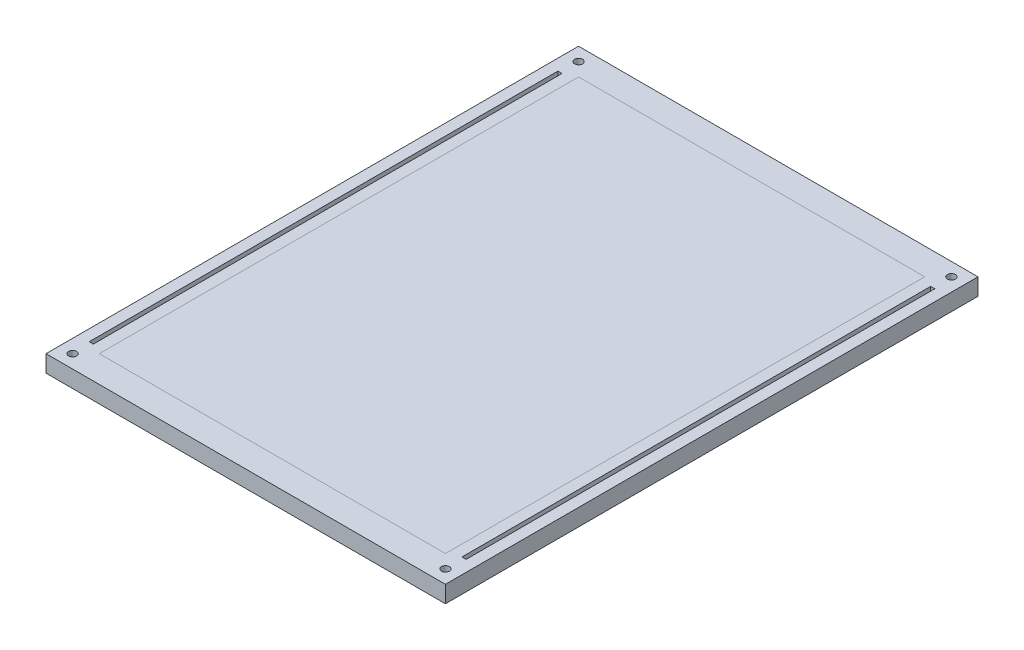
ISO-10303-21;
HEADER;
FILE_DESCRIPTION(('STEP AP214'),'2;1');
FILE_NAME('part.step','',(''),(''),'','','');
FILE_SCHEMA(('AUTOMOTIVE_DESIGN { 1 0 10303 214 1 1 1 1 }'));
ENDSEC;
DATA;
#1=APPLICATION_CONTEXT('core data for automotive mechanical design processes');
#2=APPLICATION_PROTOCOL_DEFINITION('international standard','automotive_design',2000,#1);
#3=PRODUCT_CONTEXT('',#1,'mechanical');
#4=PRODUCT('Part','Part','',(#3));
#5=PRODUCT_RELATED_PRODUCT_CATEGORY('part','',(#4));
#6=PRODUCT_DEFINITION_FORMATION('','',#4);
#7=PRODUCT_DEFINITION_CONTEXT('part definition',#1,'design');
#8=PRODUCT_DEFINITION('design','',#6,#7);
#9=PRODUCT_DEFINITION_SHAPE('','',#8);
#10=(LENGTH_UNIT() NAMED_UNIT(*) SI_UNIT(.MILLI.,.METRE.));
#11=(NAMED_UNIT(*) PLANE_ANGLE_UNIT() SI_UNIT($,.RADIAN.));
#12=(NAMED_UNIT(*) SI_UNIT($,.STERADIAN.) SOLID_ANGLE_UNIT());
#13=UNCERTAINTY_MEASURE_WITH_UNIT(LENGTH_MEASURE(1.E-05),#10,'distance_accuracy_value','');
#14=(GEOMETRIC_REPRESENTATION_CONTEXT(3) GLOBAL_UNCERTAINTY_ASSIGNED_CONTEXT((#13)) GLOBAL_UNIT_ASSIGNED_CONTEXT((#10,
#11,#12)) REPRESENTATION_CONTEXT('',''));
#15=CARTESIAN_POINT('',(0.,0.,0.));
#16=DIRECTION('',(0.,0.,1.));
#17=DIRECTION('',(1.,0.,0.));
#18=AXIS2_PLACEMENT_3D('',#15,#16,#17);
#19=CARTESIAN_POINT('',(65.0000000000001,0.,0.));
#20=DIRECTION('',(-1.,0.,0.));
#21=DIRECTION('',(0.,0.,1.));
#22=AXIS2_PLACEMENT_3D('',#19,#20,#21);
#23=PLANE('',#22);
#24=DIRECTION('',(0.,-1.,0.));
#25=VECTOR('',#24,1.);
#26=CARTESIAN_POINT('',(65.0000000000001,3.175,-90.));
#27=LINE('',#26,#25);
#28=CARTESIAN_POINT('',(65.0000000000001,3.175,-90.));
#29=VERTEX_POINT('',#28);
#30=CARTESIAN_POINT('',(65.0000000000001,-3.175,-90.));
#31=VERTEX_POINT('',#30);
#32=EDGE_CURVE('E108',#29,#31,#27,.T.);
#33=ORIENTED_EDGE('',*,*,#32,.F.);
#34=DIRECTION('',(0.,0.,-1.));
#35=VECTOR('',#34,1.);
#36=CARTESIAN_POINT('',(65.0000000000001,3.175,90.));
#37=LINE('',#36,#35);
#38=CARTESIAN_POINT('',(65.0000000000001,3.175,90.));
#39=VERTEX_POINT('',#38);
#40=EDGE_CURVE('E119',#39,#29,#37,.T.);
#41=ORIENTED_EDGE('',*,*,#40,.F.);
#42=DIRECTION('',(0.,1.,0.));
#43=VECTOR('',#42,1.);
#44=CARTESIAN_POINT('',(65.0000000000001,-3.175,90.));
#45=LINE('',#44,#43);
#46=CARTESIAN_POINT('',(65.0000000000001,-3.175,90.));
#47=VERTEX_POINT('',#46);
#48=EDGE_CURVE('E110',#47,#39,#45,.T.);
#49=ORIENTED_EDGE('',*,*,#48,.F.);
#50=DIRECTION('',(0.,0.,1.));
#51=VECTOR('',#50,1.);
#52=CARTESIAN_POINT('',(65.0000000000001,-3.175,-90.));
#53=LINE('',#52,#51);
#54=EDGE_CURVE('E99',#31,#47,#53,.T.);
#55=ORIENTED_EDGE('',*,*,#54,.F.);
#56=EDGE_LOOP('',(#33,#41,#49,#55));
#57=FACE_BOUND('',#56,.T.);
#58=ADVANCED_FACE('F57',(#57),#23,.F.);
#59=CARTESIAN_POINT('',(-245.111972117347,3.175,90.));
#60=DIRECTION('',(0.,-1.,0.));
#61=DIRECTION('',(0.,0.,-1.));
#62=AXIS2_PLACEMENT_3D('',#59,#60,#61);
#63=PLANE('',#62);
#64=DIRECTION('',(1.,0.,0.));
#65=VECTOR('',#64,1.);
#66=CARTESIAN_POINT('',(-245.111972117347,3.175,-90.));
#67=LINE('',#66,#65);
#68=CARTESIAN_POINT('',(-65.,3.175,-90.));
#69=VERTEX_POINT('',#68);
#70=EDGE_CURVE('E113',#69,#29,#67,.T.);
#71=ORIENTED_EDGE('',*,*,#70,.F.);
#72=DIRECTION('',(0.,0.,1.));
#73=VECTOR('',#72,1.);
#74=CARTESIAN_POINT('',(-65.,3.175,90.));
#75=LINE('',#74,#73);
#76=CARTESIAN_POINT('',(-65.,3.175,90.));
#77=VERTEX_POINT('',#76);
#78=EDGE_CURVE('E61',#69,#77,#75,.T.);
#79=ORIENTED_EDGE('',*,*,#78,.T.);
#80=DIRECTION('',(1.,0.,0.));
#81=VECTOR('',#80,1.);
#82=CARTESIAN_POINT('',(-245.111972117347,3.175,90.));
#83=LINE('',#82,#81);
#84=EDGE_CURVE('E123',#77,#39,#83,.T.);
#85=ORIENTED_EDGE('',*,*,#84,.T.);
#86=ORIENTED_EDGE('',*,*,#40,.T.);
#87=EDGE_LOOP('',(#71,#79,#85,#86));
#88=FACE_BOUND('',#87,.T.);
#89=ADVANCED_FACE('F132',(#88),#63,.F.);
#90=CARTESIAN_POINT('',(-245.111972117347,-3.175,90.));
#91=DIRECTION('',(0.,0.,-1.));
#92=DIRECTION('',(-1.,0.,0.));
#93=AXIS2_PLACEMENT_3D('',#90,#91,#92);
#94=PLANE('',#93);
#95=ORIENTED_EDGE('',*,*,#84,.F.);
#96=DIRECTION('',(0.,-1.,0.));
#97=VECTOR('',#96,1.);
#98=CARTESIAN_POINT('',(-65.,-3.175,90.));
#99=LINE('',#98,#97);
#100=CARTESIAN_POINT('',(-65.,-3.175,90.));
#101=VERTEX_POINT('',#100);
#102=EDGE_CURVE('E129',#77,#101,#99,.T.);
#103=ORIENTED_EDGE('',*,*,#102,.T.);
#104=DIRECTION('',(1.,0.,0.));
#105=VECTOR('',#104,1.);
#106=CARTESIAN_POINT('',(-245.111972117347,-3.175,90.));
#107=LINE('',#106,#105);
#108=EDGE_CURVE('E104',#101,#47,#107,.T.);
#109=ORIENTED_EDGE('',*,*,#108,.T.);
#110=ORIENTED_EDGE('',*,*,#48,.T.);
#111=EDGE_LOOP('',(#95,#103,#109,#110));
#112=FACE_BOUND('',#111,.T.);
#113=ADVANCED_FACE('F128',(#112),#94,.F.);
#114=CARTESIAN_POINT('',(-245.111972117347,-3.175,-90.));
#115=DIRECTION('',(0.,1.,0.));
#116=DIRECTION('',(0.,0.,1.));
#117=AXIS2_PLACEMENT_3D('',#114,#115,#116);
#118=PLANE('',#117);
#119=ORIENTED_EDGE('',*,*,#108,.F.);
#120=DIRECTION('',(0.,0.,-1.));
#121=VECTOR('',#120,1.);
#122=CARTESIAN_POINT('',(-65.0000000000001,-3.175,-90.));
#123=LINE('',#122,#121);
#124=CARTESIAN_POINT('',(-65.0000000000001,-3.175,-90.));
#125=VERTEX_POINT('',#124);
#126=EDGE_CURVE('E66',#101,#125,#123,.T.);
#127=ORIENTED_EDGE('',*,*,#126,.T.);
#128=DIRECTION('',(1.,0.,0.));
#129=VECTOR('',#128,1.);
#130=CARTESIAN_POINT('',(-245.111972117347,-3.175,-90.));
#131=LINE('',#130,#129);
#132=EDGE_CURVE('E96',#125,#31,#131,.T.);
#133=ORIENTED_EDGE('',*,*,#132,.T.);
#134=ORIENTED_EDGE('',*,*,#54,.T.);
#135=EDGE_LOOP('',(#119,#127,#133,#134));
#136=FACE_BOUND('',#135,.T.);
#137=ADVANCED_FACE('F98',(#136),#118,.F.);
#138=CARTESIAN_POINT('',(-245.111972117347,3.175,-90.));
#139=DIRECTION('',(0.,0.,1.));
#140=DIRECTION('',(1.,0.,0.));
#141=AXIS2_PLACEMENT_3D('',#138,#139,#140);
#142=PLANE('',#141);
#143=ORIENTED_EDGE('',*,*,#132,.F.);
#144=DIRECTION('',(0.,1.,0.));
#145=VECTOR('',#144,1.);
#146=CARTESIAN_POINT('',(-65.0000000000001,3.175,-90.));
#147=LINE('',#146,#145);
#148=EDGE_CURVE('E12',#125,#69,#147,.T.);
#149=ORIENTED_EDGE('',*,*,#148,.T.);
#150=ORIENTED_EDGE('',*,*,#70,.T.);
#151=ORIENTED_EDGE('',*,*,#32,.T.);
#152=EDGE_LOOP('',(#143,#149,#150,#151));
#153=FACE_BOUND('',#152,.T.);
#154=ADVANCED_FACE('F59',(#153),#142,.F.);
#155=CARTESIAN_POINT('',(-65.,3.175,90.));
#156=DIRECTION('',(1.,0.,0.));
#157=DIRECTION('',(0.,0.,-1.));
#158=AXIS2_PLACEMENT_3D('',#155,#156,#157);
#159=PLANE('',#158);
#160=ORIENTED_EDGE('',*,*,#126,.F.);
#161=ORIENTED_EDGE('',*,*,#102,.F.);
#162=ORIENTED_EDGE('',*,*,#78,.F.);
#163=ORIENTED_EDGE('',*,*,#148,.F.);
#164=EDGE_LOOP('',(#160,#161,#162,#163));
#165=FACE_BOUND('',#164,.T.);
#166=ADVANCED_FACE('F146',(#165),#159,.F.);
#167=CLOSED_SHELL('',(#58,#89,#113,#137,#154,#166));
#168=MANIFOLD_SOLID_BREP('B2',#167);
#169=CARTESIAN_POINT('',(0.,3.175,0.));
#170=DIRECTION('',(0.,-1.,0.));
#171=DIRECTION('',(0.,0.,-1.));
#172=AXIS2_PLACEMENT_3D('',#169,#170,#171);
#173=PLANE('',#172);
#174=CARTESIAN_POINT('',(-70.0000000000001,3.175,95.));
#175=DIRECTION('',(0.,1.,0.));
#176=DIRECTION('',(0.,0.,-1.));
#177=AXIS2_PLACEMENT_3D('',#174,#175,#176);
#178=CIRCLE('',#177,1.5);
#179=CARTESIAN_POINT('',(-70.0000000000001,3.175,93.5));
#180=VERTEX_POINT('',#179);
#181=EDGE_CURVE('E564',#180,#180,#178,.T.);
#182=ORIENTED_EDGE('',*,*,#181,.F.);
#183=EDGE_LOOP('',(#182));
#184=FACE_BOUND('',#183,.T.);
#185=CARTESIAN_POINT('',(70.0000000000001,3.175,95.));
#186=DIRECTION('',(0.,1.,0.));
#187=DIRECTION('',(0.,0.,1.));
#188=AXIS2_PLACEMENT_3D('',#185,#186,#187);
#189=CIRCLE('',#188,1.5);
#190=CARTESIAN_POINT('',(70.0000000000001,3.175,96.5));
#191=VERTEX_POINT('',#190);
#192=EDGE_CURVE('E556',#191,#191,#189,.T.);
#193=ORIENTED_EDGE('',*,*,#192,.F.);
#194=EDGE_LOOP('',(#193));
#195=FACE_BOUND('',#194,.T.);
#196=CARTESIAN_POINT('',(70.0000000000001,3.175,-95.));
#197=DIRECTION('',(0.,1.,0.));
#198=DIRECTION('',(0.,0.,-1.));
#199=AXIS2_PLACEMENT_3D('',#196,#197,#198);
#200=CIRCLE('',#199,1.5);
#201=CARTESIAN_POINT('',(70.0000000000001,3.175,-96.5));
#202=VERTEX_POINT('',#201);
#203=EDGE_CURVE('E549',#202,#202,#200,.T.);
#204=ORIENTED_EDGE('',*,*,#203,.F.);
#205=EDGE_LOOP('',(#204));
#206=FACE_BOUND('',#205,.T.);
#207=CARTESIAN_POINT('',(-70.0000000000001,3.175,-95.));
#208=DIRECTION('',(0.,1.,0.));
#209=DIRECTION('',(0.,0.,1.));
#210=AXIS2_PLACEMENT_3D('',#207,#208,#209);
#211=CIRCLE('',#210,1.5);
#212=CARTESIAN_POINT('',(-70.0000000000001,3.175,-93.5));
#213=VERTEX_POINT('',#212);
#214=EDGE_CURVE('E554',#213,#213,#211,.T.);
#215=ORIENTED_EDGE('',*,*,#214,.F.);
#216=EDGE_LOOP('',(#215));
#217=FACE_BOUND('',#216,.T.);
#218=DIRECTION('',(0.,0.,1.));
#219=VECTOR('',#218,1.);
#220=CARTESIAN_POINT('',(-65.,3.175,90.));
#221=LINE('',#220,#219);
#222=CARTESIAN_POINT('',(-65.,3.175,-90.));
#223=VERTEX_POINT('',#222);
#224=CARTESIAN_POINT('',(-65.,3.175,90.));
#225=VERTEX_POINT('',#224);
#226=EDGE_CURVE('E369',#223,#225,#221,.T.);
#227=ORIENTED_EDGE('',*,*,#226,.F.);
#228=DIRECTION('',(-1.,0.,0.));
#229=VECTOR('',#228,1.);
#230=CARTESIAN_POINT('',(-65.,3.175,-90.));
#231=LINE('',#230,#229);
#232=CARTESIAN_POINT('',(65.0000000000001,3.175,-90.));
#233=VERTEX_POINT('',#232);
#234=EDGE_CURVE('E377',#233,#223,#231,.T.);
#235=ORIENTED_EDGE('',*,*,#234,.F.);
#236=DIRECTION('',(0.,0.,-1.));
#237=VECTOR('',#236,1.);
#238=CARTESIAN_POINT('',(65.0000000000001,3.175,90.));
#239=LINE('',#238,#237);
#240=CARTESIAN_POINT('',(65.0000000000001,3.175,90.));
#241=VERTEX_POINT('',#240);
#242=EDGE_CURVE('E374',#241,#233,#239,.T.);
#243=ORIENTED_EDGE('',*,*,#242,.F.);
#244=DIRECTION('',(1.,0.,0.));
#245=VECTOR('',#244,1.);
#246=CARTESIAN_POINT('',(-65.,3.175,90.));
#247=LINE('',#246,#245);
#248=EDGE_CURVE('E371',#225,#241,#247,.T.);
#249=ORIENTED_EDGE('',*,*,#248,.F.);
#250=EDGE_LOOP('',(#227,#235,#243,#249));
#251=FACE_BOUND('',#250,.T.);
#252=DIRECTION('',(0.,0.,-1.));
#253=VECTOR('',#252,1.);
#254=CARTESIAN_POINT('',(75.0000000000001,3.175,100.));
#255=LINE('',#254,#253);
#256=CARTESIAN_POINT('',(75.0000000000001,3.175,100.));
#257=VERTEX_POINT('',#256);
#258=CARTESIAN_POINT('',(75.,3.175,-100.));
#259=VERTEX_POINT('',#258);
#260=EDGE_CURVE('E402',#257,#259,#255,.T.);
#261=ORIENTED_EDGE('',*,*,#260,.T.);
#262=DIRECTION('',(-1.,0.,0.));
#263=VECTOR('',#262,1.);
#264=CARTESIAN_POINT('',(-75.,3.175,-100.));
#265=LINE('',#264,#263);
#266=CARTESIAN_POINT('',(-75.,3.175,-100.));
#267=VERTEX_POINT('',#266);
#268=EDGE_CURVE('E405',#259,#267,#265,.T.);
#269=ORIENTED_EDGE('',*,*,#268,.T.);
#270=DIRECTION('',(0.,0.,1.));
#271=VECTOR('',#270,1.);
#272=CARTESIAN_POINT('',(-75.,3.175,100.));
#273=LINE('',#272,#271);
#274=CARTESIAN_POINT('',(-75.,3.175,100.));
#275=VERTEX_POINT('',#274);
#276=EDGE_CURVE('E409',#267,#275,#273,.T.);
#277=ORIENTED_EDGE('',*,*,#276,.T.);
#278=DIRECTION('',(1.,0.,0.));
#279=VECTOR('',#278,1.);
#280=CARTESIAN_POINT('',(-75.,3.175,100.));
#281=LINE('',#280,#279);
#282=EDGE_CURVE('E411',#275,#257,#281,.T.);
#283=ORIENTED_EDGE('',*,*,#282,.T.);
#284=EDGE_LOOP('',(#261,#269,#277,#283));
#285=FACE_BOUND('',#284,.T.);
#286=DIRECTION('',(-1.,0.,0.));
#287=VECTOR('',#286,1.);
#288=CARTESIAN_POINT('',(-70.777875,3.175,-88.));
#289=LINE('',#288,#287);
#290=CARTESIAN_POINT('',(-69.222125,3.175,-88.));
#291=VERTEX_POINT('',#290);
#292=CARTESIAN_POINT('',(-70.777875,3.175,-88.));
#293=VERTEX_POINT('',#292);
#294=EDGE_CURVE('E347',#291,#293,#289,.T.);
#295=ORIENTED_EDGE('',*,*,#294,.F.);
#296=DIRECTION('',(0.,0.,-1.));
#297=VECTOR('',#296,1.);
#298=CARTESIAN_POINT('',(-69.222125,3.175,88.));
#299=LINE('',#298,#297);
#300=CARTESIAN_POINT('',(-69.222125,3.175,88.));
#301=VERTEX_POINT('',#300);
#302=EDGE_CURVE('E345',#301,#291,#299,.T.);
#303=ORIENTED_EDGE('',*,*,#302,.F.);
#304=DIRECTION('',(1.,0.,0.));
#305=VECTOR('',#304,1.);
#306=CARTESIAN_POINT('',(-70.777875,3.175,88.));
#307=LINE('',#306,#305);
#308=CARTESIAN_POINT('',(-70.777875,3.175,88.));
#309=VERTEX_POINT('',#308);
#310=EDGE_CURVE('E353',#309,#301,#307,.T.);
#311=ORIENTED_EDGE('',*,*,#310,.F.);
#312=DIRECTION('',(0.,0.,1.));
#313=VECTOR('',#312,1.);
#314=CARTESIAN_POINT('',(-70.777875,3.175,88.));
#315=LINE('',#314,#313);
#316=EDGE_CURVE('E350',#293,#309,#315,.T.);
#317=ORIENTED_EDGE('',*,*,#316,.F.);
#318=EDGE_LOOP('',(#295,#303,#311,#317));
#319=FACE_BOUND('',#318,.T.);
#320=DIRECTION('',(0.,0.,-1.));
#321=VECTOR('',#320,1.);
#322=CARTESIAN_POINT('',(69.222125,3.175,88.));
#323=LINE('',#322,#321);
#324=CARTESIAN_POINT('',(69.222125,3.175,88.));
#325=VERTEX_POINT('',#324);
#326=CARTESIAN_POINT('',(69.222125,3.175,-88.));
#327=VERTEX_POINT('',#326);
#328=EDGE_CURVE('E203',#325,#327,#323,.T.);
#329=ORIENTED_EDGE('',*,*,#328,.T.);
#330=DIRECTION('',(1.,0.,0.));
#331=VECTOR('',#330,1.);
#332=CARTESIAN_POINT('',(70.777875,3.175,-88.));
#333=LINE('',#332,#331);
#334=CARTESIAN_POINT('',(70.777875,3.175,-88.));
#335=VERTEX_POINT('',#334);
#336=EDGE_CURVE('E309',#327,#335,#333,.T.);
#337=ORIENTED_EDGE('',*,*,#336,.T.);
#338=DIRECTION('',(0.,0.,1.));
#339=VECTOR('',#338,1.);
#340=CARTESIAN_POINT('',(70.777875,3.175,88.));
#341=LINE('',#340,#339);
#342=CARTESIAN_POINT('',(70.777875,3.175,88.));
#343=VERTEX_POINT('',#342);
#344=EDGE_CURVE('E328',#335,#343,#341,.T.);
#345=ORIENTED_EDGE('',*,*,#344,.T.);
#346=DIRECTION('',(-1.,0.,0.));
#347=VECTOR('',#346,1.);
#348=CARTESIAN_POINT('',(70.777875,3.175,88.));
#349=LINE('',#348,#347);
#350=EDGE_CURVE('E322',#343,#325,#349,.T.);
#351=ORIENTED_EDGE('',*,*,#350,.T.);
#352=EDGE_LOOP('',(#329,#337,#345,#351));
#353=FACE_BOUND('',#352,.T.);
#354=ADVANCED_FACE('F188',(#184,#195,#206,#217,#251,#285,#319,#353),#173,.F.);
#355=CARTESIAN_POINT('',(0.,-3.175,0.));
#356=DIRECTION('',(0.,-1.,0.));
#357=DIRECTION('',(0.,0.,-1.));
#358=AXIS2_PLACEMENT_3D('',#355,#356,#357);
#359=PLANE('',#358);
#360=CARTESIAN_POINT('',(-70.0000000000001,-3.175,95.));
#361=DIRECTION('',(0.,-1.,0.));
#362=DIRECTION('',(0.,0.,-1.));
#363=AXIS2_PLACEMENT_3D('',#360,#361,#362);
#364=CIRCLE('',#363,1.5);
#365=CARTESIAN_POINT('',(-70.0000000000001,-3.175,93.5));
#366=VERTEX_POINT('',#365);
#367=EDGE_CURVE('E567',#366,#366,#364,.F.);
#368=ORIENTED_EDGE('',*,*,#367,.T.);
#369=EDGE_LOOP('',(#368));
#370=FACE_BOUND('',#369,.T.);
#371=CARTESIAN_POINT('',(70.0000000000001,-3.175,95.));
#372=DIRECTION('',(0.,-1.,0.));
#373=DIRECTION('',(0.,0.,-1.));
#374=AXIS2_PLACEMENT_3D('',#371,#372,#373);
#375=CIRCLE('',#374,1.5);
#376=CARTESIAN_POINT('',(70.0000000000001,-3.175,93.5));
#377=VERTEX_POINT('',#376);
#378=EDGE_CURVE('E561',#377,#377,#375,.F.);
#379=ORIENTED_EDGE('',*,*,#378,.T.);
#380=EDGE_LOOP('',(#379));
#381=FACE_BOUND('',#380,.T.);
#382=CARTESIAN_POINT('',(70.0000000000001,-3.175,-95.));
#383=DIRECTION('',(0.,-1.,0.));
#384=DIRECTION('',(0.,0.,-1.));
#385=AXIS2_PLACEMENT_3D('',#382,#383,#384);
#386=CIRCLE('',#385,1.5);
#387=CARTESIAN_POINT('',(70.0000000000001,-3.175,-96.5));
#388=VERTEX_POINT('',#387);
#389=EDGE_CURVE('E546',#388,#388,#386,.F.);
#390=ORIENTED_EDGE('',*,*,#389,.T.);
#391=EDGE_LOOP('',(#390));
#392=FACE_BOUND('',#391,.T.);
#393=CARTESIAN_POINT('',(-70.0000000000001,-3.175,-95.));
#394=DIRECTION('',(0.,-1.,0.));
#395=DIRECTION('',(0.,0.,-1.));
#396=AXIS2_PLACEMENT_3D('',#393,#394,#395);
#397=CIRCLE('',#396,1.5);
#398=CARTESIAN_POINT('',(-70.0000000000001,-3.175,-96.5));
#399=VERTEX_POINT('',#398);
#400=EDGE_CURVE('E551',#399,#399,#397,.F.);
#401=ORIENTED_EDGE('',*,*,#400,.T.);
#402=EDGE_LOOP('',(#401));
#403=FACE_BOUND('',#402,.T.);
#404=DIRECTION('',(0.,0.,-1.));
#405=VECTOR('',#404,1.);
#406=CARTESIAN_POINT('',(-69.222125,-3.175,88.));
#407=LINE('',#406,#405);
#408=CARTESIAN_POINT('',(-69.222125,-3.175,88.));
#409=VERTEX_POINT('',#408);
#410=CARTESIAN_POINT('',(-69.222125,-3.175,-88.));
#411=VERTEX_POINT('',#410);
#412=EDGE_CURVE('E342',#409,#411,#407,.T.);
#413=ORIENTED_EDGE('',*,*,#412,.T.);
#414=DIRECTION('',(-1.,0.,0.));
#415=VECTOR('',#414,1.);
#416=CARTESIAN_POINT('',(-70.777875,-3.175,-88.));
#417=LINE('',#416,#415);
#418=CARTESIAN_POINT('',(-70.777875,-3.175,-88.));
#419=VERTEX_POINT('',#418);
#420=EDGE_CURVE('E359',#411,#419,#417,.T.);
#421=ORIENTED_EDGE('',*,*,#420,.T.);
#422=DIRECTION('',(0.,0.,1.));
#423=VECTOR('',#422,1.);
#424=CARTESIAN_POINT('',(-70.777875,-3.175,88.));
#425=LINE('',#424,#423);
#426=CARTESIAN_POINT('',(-70.777875,-3.175,88.));
#427=VERTEX_POINT('',#426);
#428=EDGE_CURVE('E315',#419,#427,#425,.T.);
#429=ORIENTED_EDGE('',*,*,#428,.T.);
#430=DIRECTION('',(1.,0.,0.));
#431=VECTOR('',#430,1.);
#432=CARTESIAN_POINT('',(-70.777875,-3.175,88.));
#433=LINE('',#432,#431);
#434=EDGE_CURVE('E339',#427,#409,#433,.T.);
#435=ORIENTED_EDGE('',*,*,#434,.T.);
#436=EDGE_LOOP('',(#413,#421,#429,#435));
#437=FACE_BOUND('',#436,.T.);
#438=DIRECTION('',(0.,0.,-1.));
#439=VECTOR('',#438,1.);
#440=CARTESIAN_POINT('',(75.0000000000001,-3.175,100.));
#441=LINE('',#440,#439);
#442=CARTESIAN_POINT('',(75.0000000000001,-3.175,100.));
#443=VERTEX_POINT('',#442);
#444=CARTESIAN_POINT('',(75.,-3.175,-100.));
#445=VERTEX_POINT('',#444);
#446=EDGE_CURVE('E401',#443,#445,#441,.T.);
#447=ORIENTED_EDGE('',*,*,#446,.F.);
#448=DIRECTION('',(1.,0.,0.));
#449=VECTOR('',#448,1.);
#450=CARTESIAN_POINT('',(-75.,-3.175,100.));
#451=LINE('',#450,#449);
#452=CARTESIAN_POINT('',(-75.,-3.175,100.));
#453=VERTEX_POINT('',#452);
#454=EDGE_CURVE('E406',#453,#443,#451,.T.);
#455=ORIENTED_EDGE('',*,*,#454,.F.);
#456=DIRECTION('',(0.,0.,1.));
#457=VECTOR('',#456,1.);
#458=CARTESIAN_POINT('',(-75.,-3.175,100.));
#459=LINE('',#458,#457);
#460=CARTESIAN_POINT('',(-75.,-3.175,-100.));
#461=VERTEX_POINT('',#460);
#462=EDGE_CURVE('E419',#461,#453,#459,.T.);
#463=ORIENTED_EDGE('',*,*,#462,.F.);
#464=DIRECTION('',(-1.,0.,0.));
#465=VECTOR('',#464,1.);
#466=CARTESIAN_POINT('',(-75.,-3.175,-100.));
#467=LINE('',#466,#465);
#468=EDGE_CURVE('E416',#445,#461,#467,.T.);
#469=ORIENTED_EDGE('',*,*,#468,.F.);
#470=EDGE_LOOP('',(#447,#455,#463,#469));
#471=FACE_BOUND('',#470,.T.);
#472=DIRECTION('',(-1.,0.,0.));
#473=VECTOR('',#472,1.);
#474=CARTESIAN_POINT('',(-65.,-3.175,-90.));
#475=LINE('',#474,#473);
#476=CARTESIAN_POINT('',(65.0000000000001,-3.175,-90.));
#477=VERTEX_POINT('',#476);
#478=CARTESIAN_POINT('',(-65.,-3.175,-90.));
#479=VERTEX_POINT('',#478);
#480=EDGE_CURVE('E372',#477,#479,#475,.T.);
#481=ORIENTED_EDGE('',*,*,#480,.T.);
#482=DIRECTION('',(0.,0.,1.));
#483=VECTOR('',#482,1.);
#484=CARTESIAN_POINT('',(-65.,-3.175,90.));
#485=LINE('',#484,#483);
#486=CARTESIAN_POINT('',(-65.,-3.175,90.));
#487=VERTEX_POINT('',#486);
#488=EDGE_CURVE('E368',#479,#487,#485,.T.);
#489=ORIENTED_EDGE('',*,*,#488,.T.);
#490=DIRECTION('',(1.,0.,0.));
#491=VECTOR('',#490,1.);
#492=CARTESIAN_POINT('',(-65.,-3.175,90.));
#493=LINE('',#492,#491);
#494=CARTESIAN_POINT('',(65.0000000000001,-3.175,90.));
#495=VERTEX_POINT('',#494);
#496=EDGE_CURVE('E383',#487,#495,#493,.T.);
#497=ORIENTED_EDGE('',*,*,#496,.T.);
#498=DIRECTION('',(0.,0.,-1.));
#499=VECTOR('',#498,1.);
#500=CARTESIAN_POINT('',(65.0000000000001,-3.175,90.));
#501=LINE('',#500,#499);
#502=EDGE_CURVE('E386',#495,#477,#501,.T.);
#503=ORIENTED_EDGE('',*,*,#502,.T.);
#504=EDGE_LOOP('',(#481,#489,#497,#503));
#505=FACE_BOUND('',#504,.T.);
#506=DIRECTION('',(1.,0.,0.));
#507=VECTOR('',#506,1.);
#508=CARTESIAN_POINT('',(70.777875,-3.175,-88.));
#509=LINE('',#508,#507);
#510=CARTESIAN_POINT('',(69.222125,-3.175,-88.));
#511=VERTEX_POINT('',#510);
#512=CARTESIAN_POINT('',(70.777875,-3.175,-88.));
#513=VERTEX_POINT('',#512);
#514=EDGE_CURVE('E320',#511,#513,#509,.T.);
#515=ORIENTED_EDGE('',*,*,#514,.F.);
#516=DIRECTION('',(0.,0.,-1.));
#517=VECTOR('',#516,1.);
#518=CARTESIAN_POINT('',(69.222125,-3.175,88.));
#519=LINE('',#518,#517);
#520=CARTESIAN_POINT('',(69.222125,-3.175,88.));
#521=VERTEX_POINT('',#520);
#522=EDGE_CURVE('E303',#521,#511,#519,.T.);
#523=ORIENTED_EDGE('',*,*,#522,.F.);
#524=DIRECTION('',(-1.,0.,0.));
#525=VECTOR('',#524,1.);
#526=CARTESIAN_POINT('',(70.777875,-3.175,88.));
#527=LINE('',#526,#525);
#528=CARTESIAN_POINT('',(70.777875,-3.175,88.));
#529=VERTEX_POINT('',#528);
#530=EDGE_CURVE('E312',#529,#521,#527,.T.);
#531=ORIENTED_EDGE('',*,*,#530,.F.);
#532=DIRECTION('',(0.,0.,1.));
#533=VECTOR('',#532,1.);
#534=CARTESIAN_POINT('',(70.777875,-3.175,88.));
#535=LINE('',#534,#533);
#536=EDGE_CURVE('E211',#513,#529,#535,.T.);
#537=ORIENTED_EDGE('',*,*,#536,.F.);
#538=EDGE_LOOP('',(#515,#523,#531,#537));
#539=FACE_BOUND('',#538,.T.);
#540=ADVANCED_FACE('F318',(#370,#381,#392,#403,#437,#471,#505,#539),#359,.T.);
#541=CARTESIAN_POINT('',(75.0000000000001,3.175,100.));
#542=DIRECTION('',(-1.,0.,0.));
#543=DIRECTION('',(0.,0.,1.));
#544=AXIS2_PLACEMENT_3D('',#541,#542,#543);
#545=PLANE('',#544);
#546=ORIENTED_EDGE('',*,*,#446,.T.);
#547=DIRECTION('',(0.,-1.,0.));
#548=VECTOR('',#547,1.);
#549=CARTESIAN_POINT('',(75.,3.175,-100.));
#550=LINE('',#549,#548);
#551=EDGE_CURVE('E55',#259,#445,#550,.T.);
#552=ORIENTED_EDGE('',*,*,#551,.F.);
#553=ORIENTED_EDGE('',*,*,#260,.F.);
#554=DIRECTION('',(0.,-1.,0.));
#555=VECTOR('',#554,1.);
#556=CARTESIAN_POINT('',(75.0000000000001,3.175,100.));
#557=LINE('',#556,#555);
#558=EDGE_CURVE('E413',#257,#443,#557,.T.);
#559=ORIENTED_EDGE('',*,*,#558,.T.);
#560=EDGE_LOOP('',(#546,#552,#553,#559));
#561=FACE_BOUND('',#560,.T.);
#562=ADVANCED_FACE('F190',(#561),#545,.F.);
#563=CARTESIAN_POINT('',(-75.,3.175,-100.));
#564=DIRECTION('',(0.,0.,1.));
#565=DIRECTION('',(1.,0.,0.));
#566=AXIS2_PLACEMENT_3D('',#563,#564,#565);
#567=PLANE('',#566);
#568=ORIENTED_EDGE('',*,*,#468,.T.);
#569=DIRECTION('',(0.,-1.,0.));
#570=VECTOR('',#569,1.);
#571=CARTESIAN_POINT('',(-75.,3.175,-100.));
#572=LINE('',#571,#570);
#573=EDGE_CURVE('E196',#267,#461,#572,.T.);
#574=ORIENTED_EDGE('',*,*,#573,.F.);
#575=ORIENTED_EDGE('',*,*,#268,.F.);
#576=ORIENTED_EDGE('',*,*,#551,.T.);
#577=EDGE_LOOP('',(#568,#574,#575,#576));
#578=FACE_BOUND('',#577,.T.);
#579=ADVANCED_FACE('F447',(#578),#567,.F.);
#580=CARTESIAN_POINT('',(-75.,3.175,100.));
#581=DIRECTION('',(1.,0.,0.));
#582=DIRECTION('',(0.,0.,-1.));
#583=AXIS2_PLACEMENT_3D('',#580,#581,#582);
#584=PLANE('',#583);
#585=ORIENTED_EDGE('',*,*,#462,.T.);
#586=DIRECTION('',(0.,-1.,0.));
#587=VECTOR('',#586,1.);
#588=CARTESIAN_POINT('',(-75.,3.175,100.));
#589=LINE('',#588,#587);
#590=EDGE_CURVE('E424',#275,#453,#589,.T.);
#591=ORIENTED_EDGE('',*,*,#590,.F.);
#592=ORIENTED_EDGE('',*,*,#276,.F.);
#593=ORIENTED_EDGE('',*,*,#573,.T.);
#594=EDGE_LOOP('',(#585,#591,#592,#593));
#595=FACE_BOUND('',#594,.T.);
#596=ADVANCED_FACE('F431',(#595),#584,.F.);
#597=CARTESIAN_POINT('',(-75.,3.175,100.));
#598=DIRECTION('',(0.,0.,-1.));
#599=DIRECTION('',(-1.,0.,0.));
#600=AXIS2_PLACEMENT_3D('',#597,#598,#599);
#601=PLANE('',#600);
#602=ORIENTED_EDGE('',*,*,#454,.T.);
#603=ORIENTED_EDGE('',*,*,#558,.F.);
#604=ORIENTED_EDGE('',*,*,#282,.F.);
#605=ORIENTED_EDGE('',*,*,#590,.T.);
#606=EDGE_LOOP('',(#602,#603,#604,#605));
#607=FACE_BOUND('',#606,.T.);
#608=ADVANCED_FACE('F440',(#607),#601,.F.);
#609=CARTESIAN_POINT('',(-65.,3.175,90.));
#610=DIRECTION('',(1.,0.,0.));
#611=DIRECTION('',(0.,0.,-1.));
#612=AXIS2_PLACEMENT_3D('',#609,#610,#611);
#613=PLANE('',#612);
#614=ORIENTED_EDGE('',*,*,#488,.F.);
#615=DIRECTION('',(0.,-1.,0.));
#616=VECTOR('',#615,1.);
#617=CARTESIAN_POINT('',(-65.,3.175,-90.));
#618=LINE('',#617,#616);
#619=EDGE_CURVE('E380',#223,#479,#618,.T.);
#620=ORIENTED_EDGE('',*,*,#619,.F.);
#621=ORIENTED_EDGE('',*,*,#226,.T.);
#622=DIRECTION('',(0.,-1.,0.));
#623=VECTOR('',#622,1.);
#624=CARTESIAN_POINT('',(-65.,3.175,90.));
#625=LINE('',#624,#623);
#626=EDGE_CURVE('E398',#225,#487,#625,.T.);
#627=ORIENTED_EDGE('',*,*,#626,.T.);
#628=EDGE_LOOP('',(#614,#620,#621,#627));
#629=FACE_BOUND('',#628,.T.);
#630=ADVANCED_FACE('F465',(#629),#613,.T.);
#631=CARTESIAN_POINT('',(-65.,3.175,90.));
#632=DIRECTION('',(0.,0.,-1.));
#633=DIRECTION('',(-1.,0.,0.));
#634=AXIS2_PLACEMENT_3D('',#631,#632,#633);
#635=PLANE('',#634);
#636=ORIENTED_EDGE('',*,*,#496,.F.);
#637=ORIENTED_EDGE('',*,*,#626,.F.);
#638=ORIENTED_EDGE('',*,*,#248,.T.);
#639=DIRECTION('',(0.,-1.,0.));
#640=VECTOR('',#639,1.);
#641=CARTESIAN_POINT('',(65.0000000000001,3.175,90.));
#642=LINE('',#641,#640);
#643=EDGE_CURVE('E396',#241,#495,#642,.T.);
#644=ORIENTED_EDGE('',*,*,#643,.T.);
#645=EDGE_LOOP('',(#636,#637,#638,#644));
#646=FACE_BOUND('',#645,.T.);
#647=ADVANCED_FACE('F472',(#646),#635,.T.);
#648=CARTESIAN_POINT('',(65.0000000000001,3.175,90.));
#649=DIRECTION('',(-1.,0.,0.));
#650=DIRECTION('',(0.,0.,1.));
#651=AXIS2_PLACEMENT_3D('',#648,#649,#650);
#652=PLANE('',#651);
#653=ORIENTED_EDGE('',*,*,#502,.F.);
#654=ORIENTED_EDGE('',*,*,#643,.F.);
#655=ORIENTED_EDGE('',*,*,#242,.T.);
#656=DIRECTION('',(0.,-1.,0.));
#657=VECTOR('',#656,1.);
#658=CARTESIAN_POINT('',(65.0000000000001,3.175,-90.));
#659=LINE('',#658,#657);
#660=EDGE_CURVE('E394',#233,#477,#659,.T.);
#661=ORIENTED_EDGE('',*,*,#660,.T.);
#662=EDGE_LOOP('',(#653,#654,#655,#661));
#663=FACE_BOUND('',#662,.T.);
#664=ADVANCED_FACE('F477',(#663),#652,.T.);
#665=CARTESIAN_POINT('',(-65.,3.175,-90.));
#666=DIRECTION('',(0.,0.,1.));
#667=DIRECTION('',(1.,0.,0.));
#668=AXIS2_PLACEMENT_3D('',#665,#666,#667);
#669=PLANE('',#668);
#670=ORIENTED_EDGE('',*,*,#480,.F.);
#671=ORIENTED_EDGE('',*,*,#660,.F.);
#672=ORIENTED_EDGE('',*,*,#234,.T.);
#673=ORIENTED_EDGE('',*,*,#619,.T.);
#674=EDGE_LOOP('',(#670,#671,#672,#673));
#675=FACE_BOUND('',#674,.T.);
#676=ADVANCED_FACE('F484',(#675),#669,.T.);
#677=CARTESIAN_POINT('',(-69.222125,-3.176,88.));
#678=DIRECTION('',(1.,0.,0.));
#679=DIRECTION('',(0.,0.,-1.));
#680=AXIS2_PLACEMENT_3D('',#677,#678,#679);
#681=PLANE('',#680);
#682=DIRECTION('',(0.,1.,0.));
#683=VECTOR('',#682,1.);
#684=CARTESIAN_POINT('',(-69.222125,-3.176,88.));
#685=LINE('',#684,#683);
#686=EDGE_CURVE('E357',#409,#301,#685,.T.);
#687=ORIENTED_EDGE('',*,*,#686,.T.);
#688=ORIENTED_EDGE('',*,*,#302,.T.);
#689=DIRECTION('',(0.,1.,0.));
#690=VECTOR('',#689,1.);
#691=CARTESIAN_POINT('',(-69.222125,-3.176,-88.));
#692=LINE('',#691,#690);
#693=EDGE_CURVE('E356',#411,#291,#692,.T.);
#694=ORIENTED_EDGE('',*,*,#693,.F.);
#695=ORIENTED_EDGE('',*,*,#412,.F.);
#696=EDGE_LOOP('',(#687,#688,#694,#695));
#697=FACE_BOUND('',#696,.T.);
#698=ADVANCED_FACE('F497',(#697),#681,.F.);
#699=CARTESIAN_POINT('',(-70.777875,-3.176,88.));
#700=DIRECTION('',(0.,0.,1.));
#701=DIRECTION('',(1.,0.,0.));
#702=AXIS2_PLACEMENT_3D('',#699,#700,#701);
#703=PLANE('',#702);
#704=DIRECTION('',(0.,1.,0.));
#705=VECTOR('',#704,1.);
#706=CARTESIAN_POINT('',(-70.777875,-3.176,88.));
#707=LINE('',#706,#705);
#708=EDGE_CURVE('E360',#427,#309,#707,.T.);
#709=ORIENTED_EDGE('',*,*,#708,.T.);
#710=ORIENTED_EDGE('',*,*,#310,.T.);
#711=ORIENTED_EDGE('',*,*,#686,.F.);
#712=ORIENTED_EDGE('',*,*,#434,.F.);
#713=EDGE_LOOP('',(#709,#710,#711,#712));
#714=FACE_BOUND('',#713,.T.);
#715=ADVANCED_FACE('F502',(#714),#703,.F.);
#716=CARTESIAN_POINT('',(-70.777875,-3.176,88.));
#717=DIRECTION('',(-1.,0.,0.));
#718=DIRECTION('',(0.,0.,1.));
#719=AXIS2_PLACEMENT_3D('',#716,#717,#718);
#720=PLANE('',#719);
#721=DIRECTION('',(0.,1.,0.));
#722=VECTOR('',#721,1.);
#723=CARTESIAN_POINT('',(-70.777875,-3.176,-88.));
#724=LINE('',#723,#722);
#725=EDGE_CURVE('E362',#419,#293,#724,.T.);
#726=ORIENTED_EDGE('',*,*,#725,.T.);
#727=ORIENTED_EDGE('',*,*,#316,.T.);
#728=ORIENTED_EDGE('',*,*,#708,.F.);
#729=ORIENTED_EDGE('',*,*,#428,.F.);
#730=EDGE_LOOP('',(#726,#727,#728,#729));
#731=FACE_BOUND('',#730,.T.);
#732=ADVANCED_FACE('F507',(#731),#720,.F.);
#733=CARTESIAN_POINT('',(-70.777875,-3.176,-88.));
#734=DIRECTION('',(0.,0.,-1.));
#735=DIRECTION('',(-1.,0.,0.));
#736=AXIS2_PLACEMENT_3D('',#733,#734,#735);
#737=PLANE('',#736);
#738=ORIENTED_EDGE('',*,*,#693,.T.);
#739=ORIENTED_EDGE('',*,*,#294,.T.);
#740=ORIENTED_EDGE('',*,*,#725,.F.);
#741=ORIENTED_EDGE('',*,*,#420,.F.);
#742=EDGE_LOOP('',(#738,#739,#740,#741));
#743=FACE_BOUND('',#742,.T.);
#744=ADVANCED_FACE('F504',(#743),#737,.F.);
#745=CARTESIAN_POINT('',(69.222125,-3.176,88.));
#746=DIRECTION('',(1.,0.,0.));
#747=DIRECTION('',(0.,0.,-1.));
#748=AXIS2_PLACEMENT_3D('',#745,#746,#747);
#749=PLANE('',#748);
#750=ORIENTED_EDGE('',*,*,#522,.T.);
#751=DIRECTION('',(0.,1.,0.));
#752=VECTOR('',#751,1.);
#753=CARTESIAN_POINT('',(69.222125,-3.176,-88.));
#754=LINE('',#753,#752);
#755=EDGE_CURVE('E316',#511,#327,#754,.T.);
#756=ORIENTED_EDGE('',*,*,#755,.T.);
#757=ORIENTED_EDGE('',*,*,#328,.F.);
#758=DIRECTION('',(0.,1.,0.));
#759=VECTOR('',#758,1.);
#760=CARTESIAN_POINT('',(69.222125,-3.176,88.));
#761=LINE('',#760,#759);
#762=EDGE_CURVE('E299',#521,#325,#761,.T.);
#763=ORIENTED_EDGE('',*,*,#762,.F.);
#764=EDGE_LOOP('',(#750,#756,#757,#763));
#765=FACE_BOUND('',#764,.T.);
#766=ADVANCED_FACE('F301',(#765),#749,.T.);
#767=CARTESIAN_POINT('',(70.777875,-3.176,-88.));
#768=DIRECTION('',(0.,0.,1.));
#769=DIRECTION('',(1.,0.,0.));
#770=AXIS2_PLACEMENT_3D('',#767,#768,#769);
#771=PLANE('',#770);
#772=ORIENTED_EDGE('',*,*,#514,.T.);
#773=DIRECTION('',(0.,1.,0.));
#774=VECTOR('',#773,1.);
#775=CARTESIAN_POINT('',(70.777875,-3.176,-88.));
#776=LINE('',#775,#774);
#777=EDGE_CURVE('E334',#513,#335,#776,.T.);
#778=ORIENTED_EDGE('',*,*,#777,.T.);
#779=ORIENTED_EDGE('',*,*,#336,.F.);
#780=ORIENTED_EDGE('',*,*,#755,.F.);
#781=EDGE_LOOP('',(#772,#778,#779,#780));
#782=FACE_BOUND('',#781,.T.);
#783=ADVANCED_FACE('F517',(#782),#771,.T.);
#784=CARTESIAN_POINT('',(70.777875,-3.176,88.));
#785=DIRECTION('',(-1.,0.,0.));
#786=DIRECTION('',(0.,0.,1.));
#787=AXIS2_PLACEMENT_3D('',#784,#785,#786);
#788=PLANE('',#787);
#789=ORIENTED_EDGE('',*,*,#536,.T.);
#790=DIRECTION('',(0.,1.,0.));
#791=VECTOR('',#790,1.);
#792=CARTESIAN_POINT('',(70.777875,-3.176,88.));
#793=LINE('',#792,#791);
#794=EDGE_CURVE('E308',#529,#343,#793,.T.);
#795=ORIENTED_EDGE('',*,*,#794,.T.);
#796=ORIENTED_EDGE('',*,*,#344,.F.);
#797=ORIENTED_EDGE('',*,*,#777,.F.);
#798=EDGE_LOOP('',(#789,#795,#796,#797));
#799=FACE_BOUND('',#798,.T.);
#800=ADVANCED_FACE('F521',(#799),#788,.T.);
#801=CARTESIAN_POINT('',(70.777875,-3.176,88.));
#802=DIRECTION('',(0.,0.,-1.));
#803=DIRECTION('',(-1.,0.,0.));
#804=AXIS2_PLACEMENT_3D('',#801,#802,#803);
#805=PLANE('',#804);
#806=ORIENTED_EDGE('',*,*,#530,.T.);
#807=ORIENTED_EDGE('',*,*,#762,.T.);
#808=ORIENTED_EDGE('',*,*,#350,.F.);
#809=ORIENTED_EDGE('',*,*,#794,.F.);
#810=EDGE_LOOP('',(#806,#807,#808,#809));
#811=FACE_BOUND('',#810,.T.);
#812=ADVANCED_FACE('F313',(#811),#805,.T.);
#813=CARTESIAN_POINT('',(-70.0000000000001,-3.176,-95.));
#814=DIRECTION('',(0.,1.,0.));
#815=DIRECTION('',(0.,0.,1.));
#816=AXIS2_PLACEMENT_3D('',#813,#814,#815);
#817=CYLINDRICAL_SURFACE('',#816,1.5);
#818=ORIENTED_EDGE('',*,*,#400,.F.);
#819=EDGE_LOOP('',(#818));
#820=FACE_BOUND('',#819,.T.);
#821=ORIENTED_EDGE('',*,*,#214,.T.);
#822=EDGE_LOOP('',(#821));
#823=FACE_BOUND('',#822,.T.);
#824=ADVANCED_FACE('F520',(#820,#823),#817,.F.);
#825=CARTESIAN_POINT('',(70.0000000000001,-3.176,-95.));
#826=DIRECTION('',(0.,1.,0.));
#827=DIRECTION('',(0.,0.,1.));
#828=AXIS2_PLACEMENT_3D('',#825,#826,#827);
#829=CYLINDRICAL_SURFACE('',#828,1.5);
#830=ORIENTED_EDGE('',*,*,#389,.F.);
#831=EDGE_LOOP('',(#830));
#832=FACE_BOUND('',#831,.T.);
#833=ORIENTED_EDGE('',*,*,#203,.T.);
#834=EDGE_LOOP('',(#833));
#835=FACE_BOUND('',#834,.T.);
#836=ADVANCED_FACE('F529',(#832,#835),#829,.F.);
#837=CARTESIAN_POINT('',(70.0000000000001,-3.176,95.));
#838=DIRECTION('',(0.,1.,0.));
#839=DIRECTION('',(0.,0.,1.));
#840=AXIS2_PLACEMENT_3D('',#837,#838,#839);
#841=CYLINDRICAL_SURFACE('',#840,1.5);
#842=ORIENTED_EDGE('',*,*,#378,.F.);
#843=EDGE_LOOP('',(#842));
#844=FACE_BOUND('',#843,.T.);
#845=ORIENTED_EDGE('',*,*,#192,.T.);
#846=EDGE_LOOP('',(#845));
#847=FACE_BOUND('',#846,.T.);
#848=ADVANCED_FACE('F534',(#844,#847),#841,.F.);
#849=CARTESIAN_POINT('',(-70.0000000000001,-3.176,95.));
#850=DIRECTION('',(0.,1.,0.));
#851=DIRECTION('',(0.,0.,1.));
#852=AXIS2_PLACEMENT_3D('',#849,#850,#851);
#853=CYLINDRICAL_SURFACE('',#852,1.5);
#854=ORIENTED_EDGE('',*,*,#367,.F.);
#855=EDGE_LOOP('',(#854));
#856=FACE_BOUND('',#855,.T.);
#857=ORIENTED_EDGE('',*,*,#181,.T.);
#858=EDGE_LOOP('',(#857));
#859=FACE_BOUND('',#858,.T.);
#860=ADVANCED_FACE('F531',(#856,#859),#853,.F.);
#861=CLOSED_SHELL('',(#354,#540,#562,#579,#596,#608,#630,#647,#664,#676,#698,#715,#732,#744,
#766,#783,#800,#812,#824,#836,#848,#860));
#862=MANIFOLD_SOLID_BREP('B6',#861);
#863=ADVANCED_BREP_SHAPE_REPRESENTATION('',(#18,#168,#862),#14);
#864=SHAPE_DEFINITION_REPRESENTATION(#9,#863);
ENDSEC;
END-ISO-10303-21;
